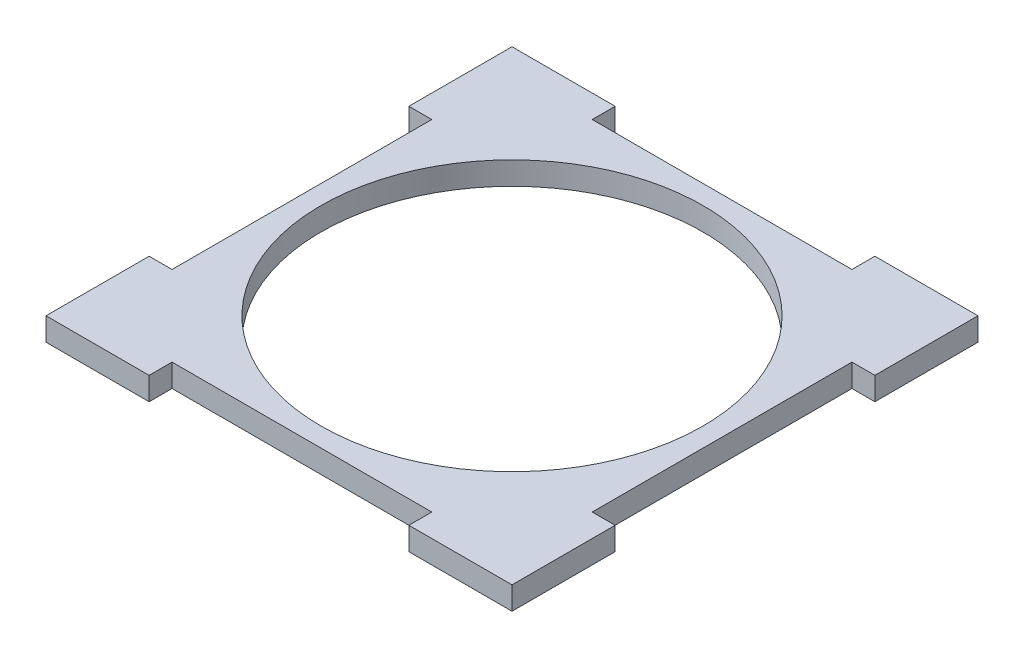
ISO-10303-21;
HEADER;
FILE_DESCRIPTION(('STEP AP214'),'2;1');
FILE_NAME('part.step','',(''),(''),'','','');
FILE_SCHEMA(('AUTOMOTIVE_DESIGN { 1 0 10303 214 1 1 1 1 }'));
ENDSEC;
DATA;
#1=APPLICATION_CONTEXT('core data for automotive mechanical design processes');
#2=APPLICATION_PROTOCOL_DEFINITION('international standard','automotive_design',2000,#1);
#3=PRODUCT_CONTEXT('',#1,'mechanical');
#4=PRODUCT('Part','Part','',(#3));
#5=PRODUCT_RELATED_PRODUCT_CATEGORY('part','',(#4));
#6=PRODUCT_DEFINITION_FORMATION('','',#4);
#7=PRODUCT_DEFINITION_CONTEXT('part definition',#1,'design');
#8=PRODUCT_DEFINITION('design','',#6,#7);
#9=PRODUCT_DEFINITION_SHAPE('','',#8);
#10=(LENGTH_UNIT() NAMED_UNIT(*) SI_UNIT(.MILLI.,.METRE.));
#11=(NAMED_UNIT(*) PLANE_ANGLE_UNIT() SI_UNIT($,.RADIAN.));
#12=(NAMED_UNIT(*) SI_UNIT($,.STERADIAN.) SOLID_ANGLE_UNIT());
#13=UNCERTAINTY_MEASURE_WITH_UNIT(LENGTH_MEASURE(1.E-05),#10,'distance_accuracy_value','');
#14=(GEOMETRIC_REPRESENTATION_CONTEXT(3) GLOBAL_UNCERTAINTY_ASSIGNED_CONTEXT((#13)) GLOBAL_UNIT_ASSIGNED_CONTEXT((#10,
#11,#12)) REPRESENTATION_CONTEXT('',''));
#15=CARTESIAN_POINT('',(0.,0.,0.));
#16=DIRECTION('',(0.,0.,1.));
#17=DIRECTION('',(1.,0.,0.));
#18=AXIS2_PLACEMENT_3D('',#15,#16,#17);
#19=CARTESIAN_POINT('',(1.17961196366423E-13,3.,-17.));
#20=DIRECTION('',(0.,0.,-1.));
#21=DIRECTION('',(-1.,0.,0.));
#22=AXIS2_PLACEMENT_3D('',#19,#20,#21);
#23=PLANE('',#22);
#24=DIRECTION('',(1.,0.,0.));
#25=VECTOR('',#24,1.);
#26=CARTESIAN_POINT('',(1.17961196366423E-13,0.,-17.));
#27=LINE('',#26,#25);
#28=CARTESIAN_POINT('',(27.5000000000001,0.,-16.9999999999998));
#29=VERTEX_POINT('',#28);
#30=CARTESIAN_POINT('',(30.5000000000001,0.,-16.9999999999998));
#31=VERTEX_POINT('',#30);
#32=EDGE_CURVE('E207',#29,#31,#27,.T.);
#33=ORIENTED_EDGE('',*,*,#32,.T.);
#34=DIRECTION('',(0.,-1.,0.));
#35=VECTOR('',#34,1.);
#36=CARTESIAN_POINT('',(30.5000000000001,3.,-16.9999999999998));
#37=LINE('',#36,#35);
#38=CARTESIAN_POINT('',(30.5000000000001,3.,-16.9999999999998));
#39=VERTEX_POINT('',#38);
#40=EDGE_CURVE('E11',#39,#31,#37,.T.);
#41=ORIENTED_EDGE('',*,*,#40,.F.);
#42=DIRECTION('',(1.,0.,0.));
#43=VECTOR('',#42,1.);
#44=CARTESIAN_POINT('',(1.17961196366423E-13,3.,-17.));
#45=LINE('',#44,#43);
#46=CARTESIAN_POINT('',(27.5000000000001,3.,-16.9999999999998));
#47=VERTEX_POINT('',#46);
#48=EDGE_CURVE('E317',#47,#39,#45,.T.);
#49=ORIENTED_EDGE('',*,*,#48,.F.);
#50=DIRECTION('',(0.,-1.,0.));
#51=VECTOR('',#50,1.);
#52=CARTESIAN_POINT('',(27.5000000000001,3.,-16.9999999999998));
#53=LINE('',#52,#51);
#54=EDGE_CURVE('E52',#47,#29,#53,.T.);
#55=ORIENTED_EDGE('',*,*,#54,.T.);
#56=EDGE_LOOP('',(#33,#41,#49,#55));
#57=FACE_BOUND('',#56,.T.);
#58=ADVANCED_FACE('F35',(#57),#23,.F.);
#59=CARTESIAN_POINT('',(30.500000000001,3.,-1.64605983164888E-12));
#60=DIRECTION('',(-1.,0.,0.));
#61=DIRECTION('',(0.,0.,1.));
#62=AXIS2_PLACEMENT_3D('',#59,#60,#61);
#63=PLANE('',#62);
#64=DIRECTION('',(0.,0.,-1.));
#65=VECTOR('',#64,1.);
#66=CARTESIAN_POINT('',(30.500000000001,0.,-1.64605983164888E-12));
#67=LINE('',#66,#65);
#68=CARTESIAN_POINT('',(30.5000000000001,0.,-30.5000000000001));
#69=VERTEX_POINT('',#68);
#70=EDGE_CURVE('E209',#31,#69,#67,.T.);
#71=ORIENTED_EDGE('',*,*,#70,.T.);
#72=DIRECTION('',(0.,-1.,0.));
#73=VECTOR('',#72,1.);
#74=CARTESIAN_POINT('',(30.5000000000001,3.,-30.5000000000001));
#75=LINE('',#74,#73);
#76=CARTESIAN_POINT('',(30.5000000000001,3.,-30.5000000000001));
#77=VERTEX_POINT('',#76);
#78=EDGE_CURVE('E44',#77,#69,#75,.T.);
#79=ORIENTED_EDGE('',*,*,#78,.F.);
#80=DIRECTION('',(0.,0.,-1.));
#81=VECTOR('',#80,1.);
#82=CARTESIAN_POINT('',(30.500000000001,3.,-1.64605983164888E-12));
#83=LINE('',#82,#81);
#84=EDGE_CURVE('E127',#39,#77,#83,.T.);
#85=ORIENTED_EDGE('',*,*,#84,.F.);
#86=ORIENTED_EDGE('',*,*,#40,.T.);
#87=EDGE_LOOP('',(#71,#79,#85,#86));
#88=FACE_BOUND('',#87,.T.);
#89=ADVANCED_FACE('F300',(#88),#63,.F.);
#90=CARTESIAN_POINT('',(0.,3.,-30.5000000000001));
#91=DIRECTION('',(0.,0.,-1.));
#92=DIRECTION('',(-1.,0.,0.));
#93=AXIS2_PLACEMENT_3D('',#90,#91,#92);
#94=PLANE('',#93);
#95=DIRECTION('',(1.,0.,0.));
#96=VECTOR('',#95,1.);
#97=CARTESIAN_POINT('',(0.,0.,-30.5000000000001));
#98=LINE('',#97,#96);
#99=CARTESIAN_POINT('',(17.0000000000001,0.,-30.4999999999999));
#100=VERTEX_POINT('',#99);
#101=EDGE_CURVE('E212',#100,#69,#98,.T.);
#102=ORIENTED_EDGE('',*,*,#101,.F.);
#103=DIRECTION('',(0.,-1.,0.));
#104=VECTOR('',#103,1.);
#105=CARTESIAN_POINT('',(17.0000000000001,3.,-30.4999999999999));
#106=LINE('',#105,#104);
#107=CARTESIAN_POINT('',(17.0000000000001,3.,-30.4999999999999));
#108=VERTEX_POINT('',#107);
#109=EDGE_CURVE('E293',#108,#100,#106,.T.);
#110=ORIENTED_EDGE('',*,*,#109,.F.);
#111=DIRECTION('',(1.,0.,0.));
#112=VECTOR('',#111,1.);
#113=CARTESIAN_POINT('',(0.,3.,-30.5000000000001));
#114=LINE('',#113,#112);
#115=EDGE_CURVE('E299',#108,#77,#114,.T.);
#116=ORIENTED_EDGE('',*,*,#115,.T.);
#117=ORIENTED_EDGE('',*,*,#78,.T.);
#118=EDGE_LOOP('',(#102,#110,#116,#117));
#119=FACE_BOUND('',#118,.T.);
#120=ADVANCED_FACE('F297',(#119),#94,.T.);
#121=CARTESIAN_POINT('',(17.,3.,0.));
#122=DIRECTION('',(1.,0.,0.));
#123=DIRECTION('',(0.,0.,-1.));
#124=AXIS2_PLACEMENT_3D('',#121,#122,#123);
#125=PLANE('',#124);
#126=DIRECTION('',(0.,0.,1.));
#127=VECTOR('',#126,1.);
#128=CARTESIAN_POINT('',(17.,0.,0.));
#129=LINE('',#128,#127);
#130=CARTESIAN_POINT('',(17.0000000000001,0.,-27.4999999999999));
#131=VERTEX_POINT('',#130);
#132=EDGE_CURVE('E215',#100,#131,#129,.T.);
#133=ORIENTED_EDGE('',*,*,#132,.T.);
#134=DIRECTION('',(0.,-1.,0.));
#135=VECTOR('',#134,1.);
#136=CARTESIAN_POINT('',(17.0000000000001,3.,-27.4999999999999));
#137=LINE('',#136,#135);
#138=CARTESIAN_POINT('',(17.0000000000001,3.,-27.4999999999999));
#139=VERTEX_POINT('',#138);
#140=EDGE_CURVE('E291',#139,#131,#137,.T.);
#141=ORIENTED_EDGE('',*,*,#140,.F.);
#142=DIRECTION('',(0.,0.,1.));
#143=VECTOR('',#142,1.);
#144=CARTESIAN_POINT('',(17.,3.,0.));
#145=LINE('',#144,#143);
#146=EDGE_CURVE('E312',#108,#139,#145,.T.);
#147=ORIENTED_EDGE('',*,*,#146,.F.);
#148=ORIENTED_EDGE('',*,*,#109,.T.);
#149=EDGE_LOOP('',(#133,#141,#147,#148));
#150=FACE_BOUND('',#149,.T.);
#151=ADVANCED_FACE('F309',(#150),#125,.F.);
#152=CARTESIAN_POINT('',(0.,3.,-27.5));
#153=DIRECTION('',(0.,0.,-1.));
#154=DIRECTION('',(-1.,0.,0.));
#155=AXIS2_PLACEMENT_3D('',#152,#153,#154);
#156=PLANE('',#155);
#157=DIRECTION('',(1.,0.,0.));
#158=VECTOR('',#157,1.);
#159=CARTESIAN_POINT('',(0.,0.,-27.5));
#160=LINE('',#159,#158);
#161=CARTESIAN_POINT('',(-16.9999999999999,0.,-27.5000000000001));
#162=VERTEX_POINT('',#161);
#163=EDGE_CURVE('E218',#162,#131,#160,.T.);
#164=ORIENTED_EDGE('',*,*,#163,.F.);
#165=DIRECTION('',(0.,-1.,0.));
#166=VECTOR('',#165,1.);
#167=CARTESIAN_POINT('',(-16.9999999999999,3.,-27.5000000000001));
#168=LINE('',#167,#166);
#169=CARTESIAN_POINT('',(-16.9999999999999,3.,-27.5000000000001));
#170=VERTEX_POINT('',#169);
#171=EDGE_CURVE('E289',#170,#162,#168,.T.);
#172=ORIENTED_EDGE('',*,*,#171,.F.);
#173=DIRECTION('',(1.,0.,0.));
#174=VECTOR('',#173,1.);
#175=CARTESIAN_POINT('',(0.,3.,-27.5));
#176=LINE('',#175,#174);
#177=EDGE_CURVE('E314',#170,#139,#176,.T.);
#178=ORIENTED_EDGE('',*,*,#177,.T.);
#179=ORIENTED_EDGE('',*,*,#140,.T.);
#180=EDGE_LOOP('',(#164,#172,#178,#179));
#181=FACE_BOUND('',#180,.T.);
#182=ADVANCED_FACE('F375',(#181),#156,.T.);
#183=CARTESIAN_POINT('',(-17.,3.,0.));
#184=DIRECTION('',(-1.,0.,0.));
#185=DIRECTION('',(0.,0.,1.));
#186=AXIS2_PLACEMENT_3D('',#183,#184,#185);
#187=PLANE('',#186);
#188=DIRECTION('',(0.,0.,-1.));
#189=VECTOR('',#188,1.);
#190=CARTESIAN_POINT('',(-17.,0.,0.));
#191=LINE('',#190,#189);
#192=CARTESIAN_POINT('',(-16.9999999999999,0.,-30.5000000000001));
#193=VERTEX_POINT('',#192);
#194=EDGE_CURVE('E221',#162,#193,#191,.T.);
#195=ORIENTED_EDGE('',*,*,#194,.T.);
#196=DIRECTION('',(0.,-1.,0.));
#197=VECTOR('',#196,1.);
#198=CARTESIAN_POINT('',(-16.9999999999999,3.,-30.5000000000001));
#199=LINE('',#198,#197);
#200=CARTESIAN_POINT('',(-16.9999999999999,3.,-30.5000000000001));
#201=VERTEX_POINT('',#200);
#202=EDGE_CURVE('E287',#201,#193,#199,.T.);
#203=ORIENTED_EDGE('',*,*,#202,.F.);
#204=DIRECTION('',(0.,0.,-1.));
#205=VECTOR('',#204,1.);
#206=CARTESIAN_POINT('',(-17.,3.,0.));
#207=LINE('',#206,#205);
#208=EDGE_CURVE('E322',#170,#201,#207,.T.);
#209=ORIENTED_EDGE('',*,*,#208,.F.);
#210=ORIENTED_EDGE('',*,*,#171,.T.);
#211=EDGE_LOOP('',(#195,#203,#209,#210));
#212=FACE_BOUND('',#211,.T.);
#213=ADVANCED_FACE('F378',(#212),#187,.F.);
#214=CARTESIAN_POINT('',(-1.6930901125532E-12,3.,-30.500000000001));
#215=DIRECTION('',(0.,0.,-1.));
#216=DIRECTION('',(-1.,0.,0.));
#217=AXIS2_PLACEMENT_3D('',#214,#215,#216);
#218=PLANE('',#217);
#219=DIRECTION('',(1.,0.,0.));
#220=VECTOR('',#219,1.);
#221=CARTESIAN_POINT('',(-1.6930901125532E-12,0.,-30.500000000001));
#222=LINE('',#221,#220);
#223=CARTESIAN_POINT('',(-30.5,0.,-30.5000000000001));
#224=VERTEX_POINT('',#223);
#225=EDGE_CURVE('E224',#224,#193,#222,.T.);
#226=ORIENTED_EDGE('',*,*,#225,.F.);
#227=DIRECTION('',(0.,-1.,0.));
#228=VECTOR('',#227,1.);
#229=CARTESIAN_POINT('',(-30.5,3.,-30.5000000000001));
#230=LINE('',#229,#228);
#231=CARTESIAN_POINT('',(-30.5,3.,-30.5000000000001));
#232=VERTEX_POINT('',#231);
#233=EDGE_CURVE('E285',#232,#224,#230,.T.);
#234=ORIENTED_EDGE('',*,*,#233,.F.);
#235=DIRECTION('',(1.,0.,0.));
#236=VECTOR('',#235,1.);
#237=CARTESIAN_POINT('',(-1.6930901125532E-12,3.,-30.500000000001));
#238=LINE('',#237,#236);
#239=EDGE_CURVE('E324',#232,#201,#238,.T.);
#240=ORIENTED_EDGE('',*,*,#239,.T.);
#241=ORIENTED_EDGE('',*,*,#202,.T.);
#242=EDGE_LOOP('',(#226,#234,#240,#241));
#243=FACE_BOUND('',#242,.T.);
#244=ADVANCED_FACE('F382',(#243),#218,.T.);
#245=CARTESIAN_POINT('',(-30.5,3.,0.));
#246=DIRECTION('',(-1.,0.,0.));
#247=DIRECTION('',(0.,0.,1.));
#248=AXIS2_PLACEMENT_3D('',#245,#246,#247);
#249=PLANE('',#248);
#250=DIRECTION('',(0.,0.,-1.));
#251=VECTOR('',#250,1.);
#252=CARTESIAN_POINT('',(-30.5,0.,0.));
#253=LINE('',#252,#251);
#254=CARTESIAN_POINT('',(-30.5,0.,-17.));
#255=VERTEX_POINT('',#254);
#256=EDGE_CURVE('E227',#255,#224,#253,.T.);
#257=ORIENTED_EDGE('',*,*,#256,.F.);
#258=DIRECTION('',(0.,-1.,0.));
#259=VECTOR('',#258,1.);
#260=CARTESIAN_POINT('',(-30.5,3.,-17.));
#261=LINE('',#260,#259);
#262=CARTESIAN_POINT('',(-30.5,3.,-17.));
#263=VERTEX_POINT('',#262);
#264=EDGE_CURVE('E283',#263,#255,#261,.T.);
#265=ORIENTED_EDGE('',*,*,#264,.F.);
#266=DIRECTION('',(0.,0.,-1.));
#267=VECTOR('',#266,1.);
#268=CARTESIAN_POINT('',(-30.5,3.,0.));
#269=LINE('',#268,#267);
#270=EDGE_CURVE('E327',#263,#232,#269,.T.);
#271=ORIENTED_EDGE('',*,*,#270,.T.);
#272=ORIENTED_EDGE('',*,*,#233,.T.);
#273=EDGE_LOOP('',(#257,#265,#271,#272));
#274=FACE_BOUND('',#273,.T.);
#275=ADVANCED_FACE('F386',(#274),#249,.T.);
#276=CARTESIAN_POINT('',(0.,3.,-17.));
#277=DIRECTION('',(0.,0.,-1.));
#278=DIRECTION('',(-1.,0.,0.));
#279=AXIS2_PLACEMENT_3D('',#276,#277,#278);
#280=PLANE('',#279);
#281=DIRECTION('',(1.,0.,0.));
#282=VECTOR('',#281,1.);
#283=CARTESIAN_POINT('',(0.,0.,-17.));
#284=LINE('',#283,#282);
#285=CARTESIAN_POINT('',(-27.5,0.,-17.));
#286=VERTEX_POINT('',#285);
#287=EDGE_CURVE('E230',#255,#286,#284,.T.);
#288=ORIENTED_EDGE('',*,*,#287,.T.);
#289=DIRECTION('',(0.,-1.,0.));
#290=VECTOR('',#289,1.);
#291=CARTESIAN_POINT('',(-27.5,3.,-17.));
#292=LINE('',#291,#290);
#293=CARTESIAN_POINT('',(-27.5,3.,-17.));
#294=VERTEX_POINT('',#293);
#295=EDGE_CURVE('E281',#294,#286,#292,.T.);
#296=ORIENTED_EDGE('',*,*,#295,.F.);
#297=DIRECTION('',(1.,0.,0.));
#298=VECTOR('',#297,1.);
#299=CARTESIAN_POINT('',(0.,3.,-17.));
#300=LINE('',#299,#298);
#301=EDGE_CURVE('E330',#263,#294,#300,.T.);
#302=ORIENTED_EDGE('',*,*,#301,.F.);
#303=ORIENTED_EDGE('',*,*,#264,.T.);
#304=EDGE_LOOP('',(#288,#296,#302,#303));
#305=FACE_BOUND('',#304,.T.);
#306=ADVANCED_FACE('F390',(#305),#280,.F.);
#307=CARTESIAN_POINT('',(-27.5,3.,0.));
#308=DIRECTION('',(-1.,0.,0.));
#309=DIRECTION('',(0.,0.,1.));
#310=AXIS2_PLACEMENT_3D('',#307,#308,#309);
#311=PLANE('',#310);
#312=DIRECTION('',(0.,0.,-1.));
#313=VECTOR('',#312,1.);
#314=CARTESIAN_POINT('',(-27.5,0.,0.));
#315=LINE('',#314,#313);
#316=CARTESIAN_POINT('',(-27.5,0.,17.));
#317=VERTEX_POINT('',#316);
#318=EDGE_CURVE('E233',#317,#286,#315,.T.);
#319=ORIENTED_EDGE('',*,*,#318,.F.);
#320=DIRECTION('',(0.,-1.,0.));
#321=VECTOR('',#320,1.);
#322=CARTESIAN_POINT('',(-27.5,3.,17.));
#323=LINE('',#322,#321);
#324=CARTESIAN_POINT('',(-27.5,3.,17.));
#325=VERTEX_POINT('',#324);
#326=EDGE_CURVE('E279',#325,#317,#323,.T.);
#327=ORIENTED_EDGE('',*,*,#326,.F.);
#328=DIRECTION('',(0.,0.,-1.));
#329=VECTOR('',#328,1.);
#330=CARTESIAN_POINT('',(-27.5,3.,0.));
#331=LINE('',#330,#329);
#332=EDGE_CURVE('E332',#325,#294,#331,.T.);
#333=ORIENTED_EDGE('',*,*,#332,.T.);
#334=ORIENTED_EDGE('',*,*,#295,.T.);
#335=EDGE_LOOP('',(#319,#327,#333,#334));
#336=FACE_BOUND('',#335,.T.);
#337=ADVANCED_FACE('F394',(#336),#311,.T.);
#338=CARTESIAN_POINT('',(0.,3.,17.));
#339=DIRECTION('',(0.,0.,1.));
#340=DIRECTION('',(1.,0.,0.));
#341=AXIS2_PLACEMENT_3D('',#338,#339,#340);
#342=PLANE('',#341);
#343=DIRECTION('',(-1.,0.,0.));
#344=VECTOR('',#343,1.);
#345=CARTESIAN_POINT('',(0.,0.,17.));
#346=LINE('',#345,#344);
#347=CARTESIAN_POINT('',(-30.5,0.,17.));
#348=VERTEX_POINT('',#347);
#349=EDGE_CURVE('E236',#317,#348,#346,.T.);
#350=ORIENTED_EDGE('',*,*,#349,.T.);
#351=DIRECTION('',(0.,-1.,0.));
#352=VECTOR('',#351,1.);
#353=CARTESIAN_POINT('',(-30.5,3.,17.));
#354=LINE('',#353,#352);
#355=CARTESIAN_POINT('',(-30.5,3.,17.));
#356=VERTEX_POINT('',#355);
#357=EDGE_CURVE('E276',#356,#348,#354,.T.);
#358=ORIENTED_EDGE('',*,*,#357,.F.);
#359=DIRECTION('',(-1.,0.,0.));
#360=VECTOR('',#359,1.);
#361=CARTESIAN_POINT('',(0.,3.,17.));
#362=LINE('',#361,#360);
#363=EDGE_CURVE('E335',#325,#356,#362,.T.);
#364=ORIENTED_EDGE('',*,*,#363,.F.);
#365=ORIENTED_EDGE('',*,*,#326,.T.);
#366=EDGE_LOOP('',(#350,#358,#364,#365));
#367=FACE_BOUND('',#366,.T.);
#368=ADVANCED_FACE('F398',(#367),#342,.F.);
#369=CARTESIAN_POINT('',(-30.5,3.,0.));
#370=DIRECTION('',(1.,0.,0.));
#371=DIRECTION('',(0.,0.,-1.));
#372=AXIS2_PLACEMENT_3D('',#369,#370,#371);
#373=PLANE('',#372);
#374=DIRECTION('',(0.,0.,1.));
#375=VECTOR('',#374,1.);
#376=CARTESIAN_POINT('',(-30.5,0.,0.));
#377=LINE('',#376,#375);
#378=CARTESIAN_POINT('',(-30.5,0.,30.5000000000001));
#379=VERTEX_POINT('',#378);
#380=EDGE_CURVE('E238',#348,#379,#377,.T.);
#381=ORIENTED_EDGE('',*,*,#380,.T.);
#382=DIRECTION('',(0.,-1.,0.));
#383=VECTOR('',#382,1.);
#384=CARTESIAN_POINT('',(-30.5,3.,30.5000000000001));
#385=LINE('',#384,#383);
#386=CARTESIAN_POINT('',(-30.5,3.,30.5000000000001));
#387=VERTEX_POINT('',#386);
#388=EDGE_CURVE('E274',#387,#379,#385,.T.);
#389=ORIENTED_EDGE('',*,*,#388,.F.);
#390=DIRECTION('',(0.,0.,1.));
#391=VECTOR('',#390,1.);
#392=CARTESIAN_POINT('',(-30.5,3.,0.));
#393=LINE('',#392,#391);
#394=EDGE_CURVE('E337',#356,#387,#393,.T.);
#395=ORIENTED_EDGE('',*,*,#394,.F.);
#396=ORIENTED_EDGE('',*,*,#357,.T.);
#397=EDGE_LOOP('',(#381,#389,#395,#396));
#398=FACE_BOUND('',#397,.T.);
#399=ADVANCED_FACE('F402',(#398),#373,.F.);
#400=CARTESIAN_POINT('',(0.,3.,30.5000000000001));
#401=DIRECTION('',(0.,0.,1.));
#402=DIRECTION('',(1.,0.,0.));
#403=AXIS2_PLACEMENT_3D('',#400,#401,#402);
#404=PLANE('',#403);
#405=DIRECTION('',(-1.,0.,0.));
#406=VECTOR('',#405,1.);
#407=CARTESIAN_POINT('',(0.,0.,30.5000000000001));
#408=LINE('',#407,#406);
#409=CARTESIAN_POINT('',(-17.0000000000003,0.,30.4999999999998));
#410=VERTEX_POINT('',#409);
#411=EDGE_CURVE('E241',#410,#379,#408,.T.);
#412=ORIENTED_EDGE('',*,*,#411,.F.);
#413=DIRECTION('',(0.,-1.,0.));
#414=VECTOR('',#413,1.);
#415=CARTESIAN_POINT('',(-17.0000000000003,3.,30.4999999999998));
#416=LINE('',#415,#414);
#417=CARTESIAN_POINT('',(-17.0000000000003,3.,30.4999999999998));
#418=VERTEX_POINT('',#417);
#419=EDGE_CURVE('E272',#418,#410,#416,.T.);
#420=ORIENTED_EDGE('',*,*,#419,.F.);
#421=DIRECTION('',(-1.,0.,0.));
#422=VECTOR('',#421,1.);
#423=CARTESIAN_POINT('',(0.,3.,30.5000000000001));
#424=LINE('',#423,#422);
#425=EDGE_CURVE('E339',#418,#387,#424,.T.);
#426=ORIENTED_EDGE('',*,*,#425,.T.);
#427=ORIENTED_EDGE('',*,*,#388,.T.);
#428=EDGE_LOOP('',(#412,#420,#426,#427));
#429=FACE_BOUND('',#428,.T.);
#430=ADVANCED_FACE('F406',(#429),#404,.T.);
#431=CARTESIAN_POINT('',(-17.,3.,-1.76941794549634E-13));
#432=DIRECTION('',(-1.,0.,0.));
#433=DIRECTION('',(0.,0.,1.));
#434=AXIS2_PLACEMENT_3D('',#431,#432,#433);
#435=PLANE('',#434);
#436=DIRECTION('',(0.,0.,-1.));
#437=VECTOR('',#436,1.);
#438=CARTESIAN_POINT('',(-17.,0.,-1.76941794549634E-13));
#439=LINE('',#438,#437);
#440=CARTESIAN_POINT('',(-17.0000000000003,0.,27.4999999999998));
#441=VERTEX_POINT('',#440);
#442=EDGE_CURVE('E244',#410,#441,#439,.T.);
#443=ORIENTED_EDGE('',*,*,#442,.T.);
#444=DIRECTION('',(0.,-1.,0.));
#445=VECTOR('',#444,1.);
#446=CARTESIAN_POINT('',(-17.0000000000003,3.,27.4999999999998));
#447=LINE('',#446,#445);
#448=CARTESIAN_POINT('',(-17.0000000000003,3.,27.4999999999998));
#449=VERTEX_POINT('',#448);
#450=EDGE_CURVE('E270',#449,#441,#447,.T.);
#451=ORIENTED_EDGE('',*,*,#450,.F.);
#452=DIRECTION('',(0.,0.,-1.));
#453=VECTOR('',#452,1.);
#454=CARTESIAN_POINT('',(-17.,3.,-1.76941794549634E-13));
#455=LINE('',#454,#453);
#456=EDGE_CURVE('E342',#418,#449,#455,.T.);
#457=ORIENTED_EDGE('',*,*,#456,.F.);
#458=ORIENTED_EDGE('',*,*,#419,.T.);
#459=EDGE_LOOP('',(#443,#451,#457,#458));
#460=FACE_BOUND('',#459,.T.);
#461=ADVANCED_FACE('F410',(#460),#435,.F.);
#462=CARTESIAN_POINT('',(-2.86229373536173E-13,3.,27.5));
#463=DIRECTION('',(0.,0.,1.));
#464=DIRECTION('',(1.,0.,0.));
#465=AXIS2_PLACEMENT_3D('',#462,#463,#464);
#466=PLANE('',#465);
#467=DIRECTION('',(-1.,0.,0.));
#468=VECTOR('',#467,1.);
#469=CARTESIAN_POINT('',(-2.86229373536173E-13,0.,27.5));
#470=LINE('',#469,#468);
#471=CARTESIAN_POINT('',(16.9999999999997,0.,27.5000000000002));
#472=VERTEX_POINT('',#471);
#473=EDGE_CURVE('E247',#472,#441,#470,.T.);
#474=ORIENTED_EDGE('',*,*,#473,.F.);
#475=DIRECTION('',(0.,-1.,0.));
#476=VECTOR('',#475,1.);
#477=CARTESIAN_POINT('',(16.9999999999997,3.,27.5000000000002));
#478=LINE('',#477,#476);
#479=CARTESIAN_POINT('',(16.9999999999997,3.,27.5000000000002));
#480=VERTEX_POINT('',#479);
#481=EDGE_CURVE('E268',#480,#472,#478,.T.);
#482=ORIENTED_EDGE('',*,*,#481,.F.);
#483=DIRECTION('',(-1.,0.,0.));
#484=VECTOR('',#483,1.);
#485=CARTESIAN_POINT('',(-2.86229373536173E-13,3.,27.5));
#486=LINE('',#485,#484);
#487=EDGE_CURVE('E344',#480,#449,#486,.T.);
#488=ORIENTED_EDGE('',*,*,#487,.T.);
#489=ORIENTED_EDGE('',*,*,#450,.T.);
#490=EDGE_LOOP('',(#474,#482,#488,#489));
#491=FACE_BOUND('',#490,.T.);
#492=ADVANCED_FACE('F414',(#491),#466,.T.);
#493=CARTESIAN_POINT('',(17.,3.,1.76941794549634E-13));
#494=DIRECTION('',(1.,0.,0.));
#495=DIRECTION('',(0.,0.,-1.));
#496=AXIS2_PLACEMENT_3D('',#493,#494,#495);
#497=PLANE('',#496);
#498=DIRECTION('',(0.,0.,1.));
#499=VECTOR('',#498,1.);
#500=CARTESIAN_POINT('',(17.,0.,1.76941794549634E-13));
#501=LINE('',#500,#499);
#502=CARTESIAN_POINT('',(16.9999999999997,0.,30.5000000000002));
#503=VERTEX_POINT('',#502);
#504=EDGE_CURVE('E250',#472,#503,#501,.T.);
#505=ORIENTED_EDGE('',*,*,#504,.T.);
#506=DIRECTION('',(0.,-1.,0.));
#507=VECTOR('',#506,1.);
#508=CARTESIAN_POINT('',(16.9999999999997,3.,30.5000000000002));
#509=LINE('',#508,#507);
#510=CARTESIAN_POINT('',(16.9999999999997,3.,30.5000000000002));
#511=VERTEX_POINT('',#510);
#512=EDGE_CURVE('E266',#511,#503,#509,.T.);
#513=ORIENTED_EDGE('',*,*,#512,.F.);
#514=DIRECTION('',(0.,0.,1.));
#515=VECTOR('',#514,1.);
#516=CARTESIAN_POINT('',(17.,3.,1.76941794549634E-13));
#517=LINE('',#516,#515);
#518=EDGE_CURVE('E347',#480,#511,#517,.T.);
#519=ORIENTED_EDGE('',*,*,#518,.F.);
#520=ORIENTED_EDGE('',*,*,#481,.T.);
#521=EDGE_LOOP('',(#505,#513,#519,#520));
#522=FACE_BOUND('',#521,.T.);
#523=ADVANCED_FACE('F418',(#522),#497,.F.);
#524=CARTESIAN_POINT('',(5.17333089946849E-13,3.,30.5000000000005));
#525=DIRECTION('',(0.,0.,1.));
#526=DIRECTION('',(1.,0.,0.));
#527=AXIS2_PLACEMENT_3D('',#524,#525,#526);
#528=PLANE('',#527);
#529=DIRECTION('',(-1.,0.,0.));
#530=VECTOR('',#529,1.);
#531=CARTESIAN_POINT('',(5.17333089946849E-13,0.,30.5000000000005));
#532=LINE('',#531,#530);
#533=CARTESIAN_POINT('',(30.4999999999999,0.,30.5000000000001));
#534=VERTEX_POINT('',#533);
#535=EDGE_CURVE('E253',#534,#503,#532,.T.);
#536=ORIENTED_EDGE('',*,*,#535,.F.);
#537=DIRECTION('',(0.,-1.,0.));
#538=VECTOR('',#537,1.);
#539=CARTESIAN_POINT('',(30.4999999999999,3.,30.5000000000001));
#540=LINE('',#539,#538);
#541=CARTESIAN_POINT('',(30.4999999999999,3.,30.5000000000001));
#542=VERTEX_POINT('',#541);
#543=EDGE_CURVE('E196',#542,#534,#540,.T.);
#544=ORIENTED_EDGE('',*,*,#543,.F.);
#545=DIRECTION('',(-1.,0.,0.));
#546=VECTOR('',#545,1.);
#547=CARTESIAN_POINT('',(5.17333089946849E-13,3.,30.5000000000005));
#548=LINE('',#547,#546);
#549=EDGE_CURVE('E186',#542,#511,#548,.T.);
#550=ORIENTED_EDGE('',*,*,#549,.T.);
#551=ORIENTED_EDGE('',*,*,#512,.T.);
#552=EDGE_LOOP('',(#536,#544,#550,#551));
#553=FACE_BOUND('',#552,.T.);
#554=ADVANCED_FACE('F350',(#553),#528,.T.);
#555=CARTESIAN_POINT('',(30.4999999999999,3.,0.));
#556=DIRECTION('',(-1.,0.,0.));
#557=DIRECTION('',(0.,0.,1.));
#558=AXIS2_PLACEMENT_3D('',#555,#556,#557);
#559=PLANE('',#558);
#560=DIRECTION('',(0.,0.,-1.));
#561=VECTOR('',#560,1.);
#562=CARTESIAN_POINT('',(30.4999999999999,0.,0.));
#563=LINE('',#562,#561);
#564=CARTESIAN_POINT('',(30.4999999999999,0.,17.0000000000002));
#565=VERTEX_POINT('',#564);
#566=EDGE_CURVE('E193',#534,#565,#563,.T.);
#567=ORIENTED_EDGE('',*,*,#566,.T.);
#568=DIRECTION('',(0.,-1.,0.));
#569=VECTOR('',#568,1.);
#570=CARTESIAN_POINT('',(30.4999999999999,3.,17.0000000000002));
#571=LINE('',#570,#569);
#572=CARTESIAN_POINT('',(30.4999999999999,3.,17.0000000000002));
#573=VERTEX_POINT('',#572);
#574=EDGE_CURVE('E190',#573,#565,#571,.T.);
#575=ORIENTED_EDGE('',*,*,#574,.F.);
#576=DIRECTION('',(0.,0.,-1.));
#577=VECTOR('',#576,1.);
#578=CARTESIAN_POINT('',(30.4999999999999,3.,0.));
#579=LINE('',#578,#577);
#580=EDGE_CURVE('E179',#542,#573,#579,.T.);
#581=ORIENTED_EDGE('',*,*,#580,.F.);
#582=ORIENTED_EDGE('',*,*,#543,.T.);
#583=EDGE_LOOP('',(#567,#575,#581,#582));
#584=FACE_BOUND('',#583,.T.);
#585=ADVANCED_FACE('F191',(#584),#559,.F.);
#586=CARTESIAN_POINT('',(-1.17961196366423E-13,3.,17.));
#587=DIRECTION('',(0.,0.,1.));
#588=DIRECTION('',(1.,0.,0.));
#589=AXIS2_PLACEMENT_3D('',#586,#587,#588);
#590=PLANE('',#589);
#591=DIRECTION('',(-1.,0.,0.));
#592=VECTOR('',#591,1.);
#593=CARTESIAN_POINT('',(-1.17961196366423E-13,0.,17.));
#594=LINE('',#593,#592);
#595=CARTESIAN_POINT('',(27.4999999999999,0.,17.0000000000002));
#596=VERTEX_POINT('',#595);
#597=EDGE_CURVE('E257',#565,#596,#594,.T.);
#598=ORIENTED_EDGE('',*,*,#597,.T.);
#599=DIRECTION('',(0.,-1.,0.));
#600=VECTOR('',#599,1.);
#601=CARTESIAN_POINT('',(27.4999999999999,3.,17.0000000000002));
#602=LINE('',#601,#600);
#603=CARTESIAN_POINT('',(27.4999999999999,3.,17.0000000000002));
#604=VERTEX_POINT('',#603);
#605=EDGE_CURVE('E115',#604,#596,#602,.T.);
#606=ORIENTED_EDGE('',*,*,#605,.F.);
#607=DIRECTION('',(-1.,0.,0.));
#608=VECTOR('',#607,1.);
#609=CARTESIAN_POINT('',(-1.17961196366423E-13,3.,17.));
#610=LINE('',#609,#608);
#611=EDGE_CURVE('E184',#573,#604,#610,.T.);
#612=ORIENTED_EDGE('',*,*,#611,.F.);
#613=ORIENTED_EDGE('',*,*,#574,.T.);
#614=EDGE_LOOP('',(#598,#606,#612,#613));
#615=FACE_BOUND('',#614,.T.);
#616=ADVANCED_FACE('F198',(#615),#590,.F.);
#617=CARTESIAN_POINT('',(0.,3.,0.));
#618=DIRECTION('',(0.,-1.,0.));
#619=DIRECTION('',(0.,0.,-1.));
#620=AXIS2_PLACEMENT_3D('',#617,#618,#619);
#621=CYLINDRICAL_SURFACE('',#620,25.);
#622=CARTESIAN_POINT('',(0.,3.,0.));
#623=DIRECTION('',(0.,1.,0.));
#624=DIRECTION('',(0.,0.,1.));
#625=AXIS2_PLACEMENT_3D('',#622,#623,#624);
#626=CIRCLE('',#625,25.);
#627=CARTESIAN_POINT('',(0.,3.,25.));
#628=VERTEX_POINT('',#627);
#629=EDGE_CURVE('E262',#628,#628,#626,.T.);
#630=ORIENTED_EDGE('',*,*,#629,.T.);
#631=EDGE_LOOP('',(#630));
#632=FACE_BOUND('',#631,.T.);
#633=CARTESIAN_POINT('',(0.,0.,0.));
#634=DIRECTION('',(0.,1.,0.));
#635=DIRECTION('',(0.,0.,1.));
#636=AXIS2_PLACEMENT_3D('',#633,#634,#635);
#637=CIRCLE('',#636,25.);
#638=CARTESIAN_POINT('',(0.,0.,25.));
#639=VERTEX_POINT('',#638);
#640=EDGE_CURVE('E204',#639,#639,#637,.T.);
#641=ORIENTED_EDGE('',*,*,#640,.F.);
#642=EDGE_LOOP('',(#641));
#643=FACE_BOUND('',#642,.T.);
#644=ADVANCED_FACE('F37',(#632,#643),#621,.F.);
#645=CARTESIAN_POINT('',(27.5,3.,1.90819582357449E-13));
#646=DIRECTION('',(1.,0.,0.));
#647=DIRECTION('',(0.,0.,-1.));
#648=AXIS2_PLACEMENT_3D('',#645,#646,#647);
#649=PLANE('',#648);
#650=DIRECTION('',(0.,0.,1.));
#651=VECTOR('',#650,1.);
#652=CARTESIAN_POINT('',(27.5,0.,1.90819582357449E-13));
#653=LINE('',#652,#651);
#654=EDGE_CURVE('E259',#29,#596,#653,.T.);
#655=ORIENTED_EDGE('',*,*,#654,.F.);
#656=ORIENTED_EDGE('',*,*,#54,.F.);
#657=DIRECTION('',(0.,0.,1.));
#658=VECTOR('',#657,1.);
#659=CARTESIAN_POINT('',(27.5,3.,1.90819582357449E-13));
#660=LINE('',#659,#658);
#661=EDGE_CURVE('E199',#47,#604,#660,.T.);
#662=ORIENTED_EDGE('',*,*,#661,.T.);
#663=ORIENTED_EDGE('',*,*,#605,.T.);
#664=EDGE_LOOP('',(#655,#656,#662,#663));
#665=FACE_BOUND('',#664,.T.);
#666=ADVANCED_FACE('F353',(#665),#649,.T.);
#667=CARTESIAN_POINT('',(0.,3.,0.));
#668=DIRECTION('',(0.,1.,0.));
#669=DIRECTION('',(0.,0.,1.));
#670=AXIS2_PLACEMENT_3D('',#667,#668,#669);
#671=PLANE('',#670);
#672=ORIENTED_EDGE('',*,*,#629,.F.);
#673=EDGE_LOOP('',(#672));
#674=FACE_BOUND('',#673,.T.);
#675=ORIENTED_EDGE('',*,*,#48,.T.);
#676=ORIENTED_EDGE('',*,*,#84,.T.);
#677=ORIENTED_EDGE('',*,*,#115,.F.);
#678=ORIENTED_EDGE('',*,*,#146,.T.);
#679=ORIENTED_EDGE('',*,*,#177,.F.);
#680=ORIENTED_EDGE('',*,*,#208,.T.);
#681=ORIENTED_EDGE('',*,*,#239,.F.);
#682=ORIENTED_EDGE('',*,*,#270,.F.);
#683=ORIENTED_EDGE('',*,*,#301,.T.);
#684=ORIENTED_EDGE('',*,*,#332,.F.);
#685=ORIENTED_EDGE('',*,*,#363,.T.);
#686=ORIENTED_EDGE('',*,*,#394,.T.);
#687=ORIENTED_EDGE('',*,*,#425,.F.);
#688=ORIENTED_EDGE('',*,*,#456,.T.);
#689=ORIENTED_EDGE('',*,*,#487,.F.);
#690=ORIENTED_EDGE('',*,*,#518,.T.);
#691=ORIENTED_EDGE('',*,*,#549,.F.);
#692=ORIENTED_EDGE('',*,*,#580,.T.);
#693=ORIENTED_EDGE('',*,*,#611,.T.);
#694=ORIENTED_EDGE('',*,*,#661,.F.);
#695=EDGE_LOOP('',(#675,#676,#677,#678,#679,#680,#681,#682,#683,#684,#685,#686,#687,#688,#689,
#690,#691,#692,#693,#694));
#696=FACE_BOUND('',#695,.T.);
#697=ADVANCED_FACE('F181',(#674,#696),#671,.T.);
#698=CARTESIAN_POINT('',(0.,0.,0.));
#699=DIRECTION('',(0.,1.,0.));
#700=DIRECTION('',(0.,0.,1.));
#701=AXIS2_PLACEMENT_3D('',#698,#699,#700);
#702=PLANE('',#701);
#703=ORIENTED_EDGE('',*,*,#640,.T.);
#704=EDGE_LOOP('',(#703));
#705=FACE_BOUND('',#704,.T.);
#706=ORIENTED_EDGE('',*,*,#32,.F.);
#707=ORIENTED_EDGE('',*,*,#654,.T.);
#708=ORIENTED_EDGE('',*,*,#597,.F.);
#709=ORIENTED_EDGE('',*,*,#566,.F.);
#710=ORIENTED_EDGE('',*,*,#535,.T.);
#711=ORIENTED_EDGE('',*,*,#504,.F.);
#712=ORIENTED_EDGE('',*,*,#473,.T.);
#713=ORIENTED_EDGE('',*,*,#442,.F.);
#714=ORIENTED_EDGE('',*,*,#411,.T.);
#715=ORIENTED_EDGE('',*,*,#380,.F.);
#716=ORIENTED_EDGE('',*,*,#349,.F.);
#717=ORIENTED_EDGE('',*,*,#318,.T.);
#718=ORIENTED_EDGE('',*,*,#287,.F.);
#719=ORIENTED_EDGE('',*,*,#256,.T.);
#720=ORIENTED_EDGE('',*,*,#225,.T.);
#721=ORIENTED_EDGE('',*,*,#194,.F.);
#722=ORIENTED_EDGE('',*,*,#163,.T.);
#723=ORIENTED_EDGE('',*,*,#132,.F.);
#724=ORIENTED_EDGE('',*,*,#101,.T.);
#725=ORIENTED_EDGE('',*,*,#70,.F.);
#726=EDGE_LOOP('',(#706,#707,#708,#709,#710,#711,#712,#713,#714,#715,#716,#717,#718,#719,#720,
#721,#722,#723,#724,#725));
#727=FACE_BOUND('',#726,.T.);
#728=ADVANCED_FACE('F304',(#705,#727),#702,.F.);
#729=CLOSED_SHELL('',(#58,#89,#120,#151,#182,#213,#244,#275,#306,#337,#368,#399,#430,#461,#492,
#523,#554,#585,#616,#644,#666,#697,#728));
#730=MANIFOLD_SOLID_BREP('B2',#729);
#731=ADVANCED_BREP_SHAPE_REPRESENTATION('',(#18,#730),#14);
#732=SHAPE_DEFINITION_REPRESENTATION(#9,#731);
ENDSEC;
END-ISO-10303-21;
